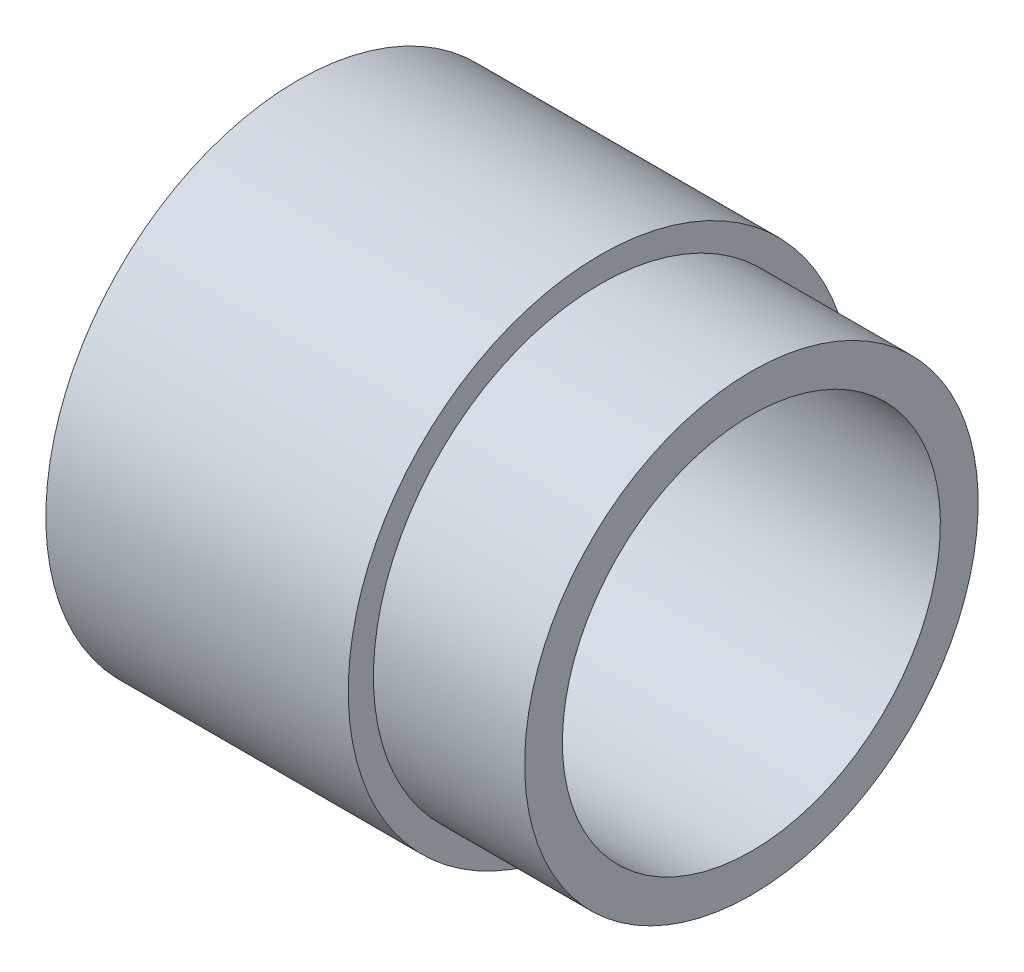
ISO-10303-21;
HEADER;
FILE_DESCRIPTION(('STEP AP214'),'2;1');
FILE_NAME('part.step','',(''),(''),'','','');
FILE_SCHEMA(('AUTOMOTIVE_DESIGN { 1 0 10303 214 1 1 1 1 }'));
ENDSEC;
DATA;
#1=APPLICATION_CONTEXT('core data for automotive mechanical design processes');
#2=APPLICATION_PROTOCOL_DEFINITION('international standard','automotive_design',2000,#1);
#3=PRODUCT_CONTEXT('',#1,'mechanical');
#4=PRODUCT('Part','Part','',(#3));
#5=PRODUCT_RELATED_PRODUCT_CATEGORY('part','',(#4));
#6=PRODUCT_DEFINITION_FORMATION('','',#4);
#7=PRODUCT_DEFINITION_CONTEXT('part definition',#1,'design');
#8=PRODUCT_DEFINITION('design','',#6,#7);
#9=PRODUCT_DEFINITION_SHAPE('','',#8);
#10=(LENGTH_UNIT() NAMED_UNIT(*) SI_UNIT(.MILLI.,.METRE.));
#11=(NAMED_UNIT(*) PLANE_ANGLE_UNIT() SI_UNIT($,.RADIAN.));
#12=(NAMED_UNIT(*) SI_UNIT($,.STERADIAN.) SOLID_ANGLE_UNIT());
#13=UNCERTAINTY_MEASURE_WITH_UNIT(LENGTH_MEASURE(1.E-05),#10,'distance_accuracy_value','');
#14=(GEOMETRIC_REPRESENTATION_CONTEXT(3) GLOBAL_UNCERTAINTY_ASSIGNED_CONTEXT((#13)) GLOBAL_UNIT_ASSIGNED_CONTEXT((#10,
#11,#12)) REPRESENTATION_CONTEXT('',''));
#15=CARTESIAN_POINT('',(0.,0.,0.));
#16=DIRECTION('',(0.,0.,1.));
#17=DIRECTION('',(1.,0.,0.));
#18=AXIS2_PLACEMENT_3D('',#15,#16,#17);
#19=CARTESIAN_POINT('',(5.55111512312578E-13,-3.21964677141295E-12,2.99760216648792E-12));
#20=DIRECTION('',(-1.,0.,0.));
#21=DIRECTION('',(0.,-1.,0.));
#22=AXIS2_PLACEMENT_3D('',#19,#20,#21);
#23=CYLINDRICAL_SURFACE('',#22,7.50000000000065);
#24=CARTESIAN_POINT('',(14.9571843275859,-3.22213764297656E-12,2.99780973911822E-12));
#25=DIRECTION('',(-1.,0.,0.));
#26=DIRECTION('',(0.,-1.,0.));
#27=AXIS2_PLACEMENT_3D('',#24,#25,#26);
#28=CIRCLE('',#27,7.50000000000065);
#29=CARTESIAN_POINT('',(14.9571843275859,-7.50000000000388,2.99780973911822E-12));
#30=VERTEX_POINT('',#29);
#31=EDGE_CURVE('E17',#30,#30,#28,.F.);
#32=ORIENTED_EDGE('',*,*,#31,.T.);
#33=EDGE_LOOP('',(#32));
#34=FACE_BOUND('',#33,.T.);
#35=CARTESIAN_POINT('',(1.95718432758607,-3.21997270807854E-12,2.99762932787672E-12));
#36=DIRECTION('',(-1.,0.,0.));
#37=DIRECTION('',(0.,-1.,0.));
#38=AXIS2_PLACEMENT_3D('',#35,#36,#37);
#39=CIRCLE('',#38,7.50000000000065);
#40=CARTESIAN_POINT('',(1.95718432758607,-7.50000000000387,2.99762932787672E-12));
#41=VERTEX_POINT('',#40);
#42=EDGE_CURVE('E39',#41,#41,#39,.T.);
#43=ORIENTED_EDGE('',*,*,#42,.T.);
#44=EDGE_LOOP('',(#43));
#45=FACE_BOUND('',#44,.T.);
#46=ADVANCED_FACE('F14',(#34,#45),#23,.F.);
#47=CARTESIAN_POINT('',(14.957184327586,8.99999999999779,8.88178419700125E-13));
#48=DIRECTION('',(-1.,0.,0.));
#49=DIRECTION('',(0.,-1.,0.));
#50=AXIS2_PLACEMENT_3D('',#47,#48,#49);
#51=PLANE('',#50);
#52=ORIENTED_EDGE('',*,*,#31,.F.);
#53=EDGE_LOOP('',(#52));
#54=FACE_BOUND('',#53,.T.);
#55=CARTESIAN_POINT('',(14.9571843275859,-3.22213764297656E-12,2.99780973911822E-12));
#56=DIRECTION('',(-1.,0.,0.));
#57=DIRECTION('',(0.,-1.,0.));
#58=AXIS2_PLACEMENT_3D('',#55,#56,#57);
#59=CIRCLE('',#58,9.00000000000079);
#60=CARTESIAN_POINT('',(14.9571843275859,-9.00000000000401,2.99780973911822E-12));
#61=VERTEX_POINT('',#60);
#62=EDGE_CURVE('E37',#61,#61,#59,.T.);
#63=ORIENTED_EDGE('',*,*,#62,.F.);
#64=EDGE_LOOP('',(#63));
#65=FACE_BOUND('',#64,.T.);
#66=ADVANCED_FACE('F47',(#54,#65),#51,.F.);
#67=CARTESIAN_POINT('',(1.95718432758596,7.49999999999829,3.49720252756924E-12));
#68=DIRECTION('',(1.,0.,0.));
#69=DIRECTION('',(0.,1.,0.));
#70=AXIS2_PLACEMENT_3D('',#67,#68,#69);
#71=PLANE('',#70);
#72=CARTESIAN_POINT('',(1.95718432758607,-3.21997270807854E-12,2.99762932787672E-12));
#73=DIRECTION('',(-1.,0.,0.));
#74=DIRECTION('',(0.,-1.,0.));
#75=AXIS2_PLACEMENT_3D('',#72,#73,#74);
#76=CIRCLE('',#75,9.00000000000079);
#77=CARTESIAN_POINT('',(1.95718432758607,-9.00000000000401,2.99762932787672E-12));
#78=VERTEX_POINT('',#77);
#79=EDGE_CURVE('E34',#78,#78,#76,.T.);
#80=ORIENTED_EDGE('',*,*,#79,.T.);
#81=EDGE_LOOP('',(#80));
#82=FACE_BOUND('',#81,.T.);
#83=ORIENTED_EDGE('',*,*,#42,.F.);
#84=EDGE_LOOP('',(#83));
#85=FACE_BOUND('',#84,.T.);
#86=ADVANCED_FACE('F50',(#82,#85),#71,.F.);
#87=CARTESIAN_POINT('',(5.55111512312578E-13,-3.21964677141295E-12,2.99760216648792E-12));
#88=DIRECTION('',(-1.,0.,0.));
#89=DIRECTION('',(0.,-1.,0.));
#90=AXIS2_PLACEMENT_3D('',#87,#88,#89);
#91=CYLINDRICAL_SURFACE('',#90,9.00000000000079);
#92=CARTESIAN_POINT('',(8.95718432758641,-3.2211384422544E-12,2.99772647239138E-12));
#93=DIRECTION('',(-1.,0.,0.));
#94=DIRECTION('',(0.,-1.,0.));
#95=AXIS2_PLACEMENT_3D('',#92,#93,#94);
#96=CIRCLE('',#95,9.00000000000079);
#97=CARTESIAN_POINT('',(8.95718432758641,-9.00000000000401,2.99772647239138E-12));
#98=VERTEX_POINT('',#97);
#99=EDGE_CURVE('E31',#98,#98,#96,.F.);
#100=ORIENTED_EDGE('',*,*,#99,.T.);
#101=EDGE_LOOP('',(#100));
#102=FACE_BOUND('',#101,.T.);
#103=ORIENTED_EDGE('',*,*,#62,.T.);
#104=EDGE_LOOP('',(#103));
#105=FACE_BOUND('',#104,.T.);
#106=ADVANCED_FACE('F53',(#102,#105),#91,.T.);
#107=CARTESIAN_POINT('',(5.55111512312578E-13,-3.21964677141295E-12,2.99760216648792E-12));
#108=DIRECTION('',(-1.,0.,0.));
#109=DIRECTION('',(0.,-1.,0.));
#110=AXIS2_PLACEMENT_3D('',#107,#108,#109);
#111=CYLINDRICAL_SURFACE('',#110,9.00000000000079);
#112=ORIENTED_EDGE('',*,*,#79,.F.);
#113=EDGE_LOOP('',(#112));
#114=FACE_BOUND('',#113,.T.);
#115=CARTESIAN_POINT('',(-3.04281567241377,-3.21914004081007E-12,2.99755993893768E-12));
#116=DIRECTION('',(-1.,0.,0.));
#117=DIRECTION('',(0.,-1.,0.));
#118=AXIS2_PLACEMENT_3D('',#115,#116,#117);
#119=CIRCLE('',#118,9.00000000000079);
#120=CARTESIAN_POINT('',(-3.04281567241377,-9.00000000000401,2.99755993893768E-12));
#121=VERTEX_POINT('',#120);
#122=EDGE_CURVE('E26',#121,#121,#119,.T.);
#123=ORIENTED_EDGE('',*,*,#122,.T.);
#124=EDGE_LOOP('',(#123));
#125=FACE_BOUND('',#124,.T.);
#126=ADVANCED_FACE('F55',(#114,#125),#111,.F.);
#127=CARTESIAN_POINT('',(8.95718432758685,9.99999999999912,5.38458166943201E-12));
#128=DIRECTION('',(-1.,0.,0.));
#129=DIRECTION('',(0.,-1.,0.));
#130=AXIS2_PLACEMENT_3D('',#127,#128,#129);
#131=PLANE('',#130);
#132=ORIENTED_EDGE('',*,*,#99,.F.);
#133=EDGE_LOOP('',(#132));
#134=FACE_BOUND('',#133,.T.);
#135=CARTESIAN_POINT('',(8.95718432758641,-3.2211384422544E-12,2.99772647239138E-12));
#136=DIRECTION('',(-1.,0.,0.));
#137=DIRECTION('',(0.,-1.,0.));
#138=AXIS2_PLACEMENT_3D('',#135,#136,#137);
#139=CIRCLE('',#138,10.0000000000009);
#140=CARTESIAN_POINT('',(8.95718432758641,-10.0000000000041,2.99772647239138E-12));
#141=VERTEX_POINT('',#140);
#142=EDGE_CURVE('E21',#141,#141,#139,.T.);
#143=ORIENTED_EDGE('',*,*,#142,.F.);
#144=EDGE_LOOP('',(#143));
#145=FACE_BOUND('',#144,.T.);
#146=ADVANCED_FACE('F63',(#134,#145),#131,.F.);
#147=CARTESIAN_POINT('',(-3.04281567241382,8.99999999999834,5.71764857681956E-12));
#148=DIRECTION('',(1.,0.,0.));
#149=DIRECTION('',(0.,1.,0.));
#150=AXIS2_PLACEMENT_3D('',#147,#148,#149);
#151=PLANE('',#150);
#152=CARTESIAN_POINT('',(-3.04281567241377,-3.21914004081007E-12,2.99755993893768E-12));
#153=DIRECTION('',(-1.,0.,0.));
#154=DIRECTION('',(0.,-1.,0.));
#155=AXIS2_PLACEMENT_3D('',#152,#153,#154);
#156=CIRCLE('',#155,10.0000000000009);
#157=CARTESIAN_POINT('',(-3.04281567241377,-10.0000000000041,2.99755993893768E-12));
#158=VERTEX_POINT('',#157);
#159=EDGE_CURVE('E10',#158,#158,#156,.F.);
#160=ORIENTED_EDGE('',*,*,#159,.F.);
#161=EDGE_LOOP('',(#160));
#162=FACE_BOUND('',#161,.T.);
#163=ORIENTED_EDGE('',*,*,#122,.F.);
#164=EDGE_LOOP('',(#163));
#165=FACE_BOUND('',#164,.T.);
#166=ADVANCED_FACE('F70',(#162,#165),#151,.F.);
#167=CARTESIAN_POINT('',(5.55111512312578E-13,-3.21964677141295E-12,2.99760216648792E-12));
#168=DIRECTION('',(-1.,0.,0.));
#169=DIRECTION('',(0.,-1.,0.));
#170=AXIS2_PLACEMENT_3D('',#167,#168,#169);
#171=CYLINDRICAL_SURFACE('',#170,10.0000000000009);
#172=ORIENTED_EDGE('',*,*,#142,.T.);
#173=EDGE_LOOP('',(#172));
#174=FACE_BOUND('',#173,.T.);
#175=ORIENTED_EDGE('',*,*,#159,.T.);
#176=EDGE_LOOP('',(#175));
#177=FACE_BOUND('',#176,.T.);
#178=ADVANCED_FACE('F68',(#174,#177),#171,.T.);
#179=CLOSED_SHELL('',(#46,#66,#86,#106,#126,#146,#166,#178));
#180=MANIFOLD_SOLID_BREP('B1',#179);
#181=ADVANCED_BREP_SHAPE_REPRESENTATION('',(#18,#180),#14);
#182=SHAPE_DEFINITION_REPRESENTATION(#9,#181);
ENDSEC;
END-ISO-10303-21;
